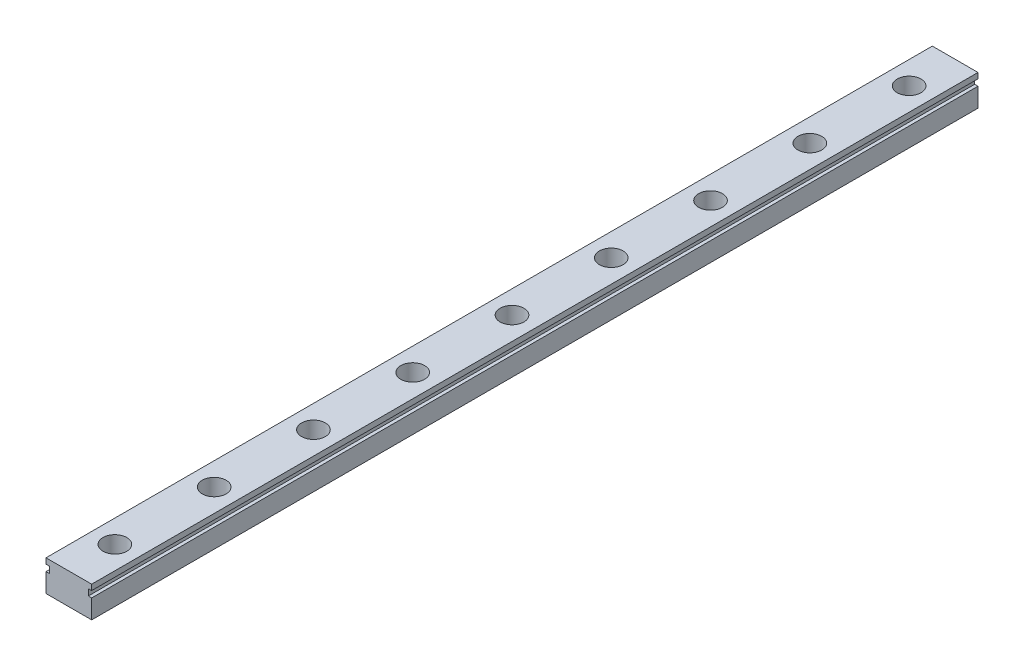
ISO-10303-21;
HEADER;
FILE_DESCRIPTION(('STEP AP214'),'2;1');
FILE_NAME('part.step','',(''),(''),'','','');
FILE_SCHEMA(('AUTOMOTIVE_DESIGN { 1 0 10303 214 1 1 1 1 }'));
ENDSEC;
DATA;
#1=APPLICATION_CONTEXT('core data for automotive mechanical design processes');
#2=APPLICATION_PROTOCOL_DEFINITION('international standard','automotive_design',2000,#1);
#3=PRODUCT_CONTEXT('',#1,'mechanical');
#4=PRODUCT('Part','Part','',(#3));
#5=PRODUCT_RELATED_PRODUCT_CATEGORY('part','',(#4));
#6=PRODUCT_DEFINITION_FORMATION('','',#4);
#7=PRODUCT_DEFINITION_CONTEXT('part definition',#1,'design');
#8=PRODUCT_DEFINITION('design','',#6,#7);
#9=PRODUCT_DEFINITION_SHAPE('','',#8);
#10=(LENGTH_UNIT() NAMED_UNIT(*) SI_UNIT(.MILLI.,.METRE.));
#11=(NAMED_UNIT(*) PLANE_ANGLE_UNIT() SI_UNIT($,.RADIAN.));
#12=(NAMED_UNIT(*) SI_UNIT($,.STERADIAN.) SOLID_ANGLE_UNIT());
#13=UNCERTAINTY_MEASURE_WITH_UNIT(LENGTH_MEASURE(1.E-05),#10,'distance_accuracy_value','');
#14=(GEOMETRIC_REPRESENTATION_CONTEXT(3) GLOBAL_UNCERTAINTY_ASSIGNED_CONTEXT((#13)) GLOBAL_UNIT_ASSIGNED_CONTEXT((#10,
#11,#12)) REPRESENTATION_CONTEXT('',''));
#15=CARTESIAN_POINT('',(0.,0.,0.));
#16=DIRECTION('',(0.,0.,1.));
#17=DIRECTION('',(1.,0.,0.));
#18=AXIS2_PLACEMENT_3D('',#15,#16,#17);
#19=CARTESIAN_POINT('',(5.75,-3.9,223.2));
#20=DIRECTION('',(-1.,0.,0.));
#21=DIRECTION('',(0.,0.,1.));
#22=AXIS2_PLACEMENT_3D('',#19,#20,#21);
#23=PLANE('',#22);
#24=DIRECTION('',(0.,1.,0.));
#25=VECTOR('',#24,1.);
#26=CARTESIAN_POINT('',(5.75,-3.9,0.));
#27=LINE('',#26,#25);
#28=CARTESIAN_POINT('',(5.75,-3.9,0.));
#29=VERTEX_POINT('',#28);
#30=CARTESIAN_POINT('',(5.75,0.900000000000001,0.));
#31=VERTEX_POINT('',#30);
#32=EDGE_CURVE('E152',#29,#31,#27,.T.);
#33=ORIENTED_EDGE('',*,*,#32,.T.);
#34=DIRECTION('',(0.,0.,1.));
#35=VECTOR('',#34,1.);
#36=CARTESIAN_POINT('',(5.75,0.900000000000001,0.));
#37=LINE('',#36,#35);
#38=CARTESIAN_POINT('',(5.75,0.900000000000001,223.2));
#39=VERTEX_POINT('',#38);
#40=EDGE_CURVE('E153',#31,#39,#37,.T.);
#41=ORIENTED_EDGE('',*,*,#40,.T.);
#42=DIRECTION('',(0.,1.,0.));
#43=VECTOR('',#42,1.);
#44=CARTESIAN_POINT('',(5.75,-3.9,223.2));
#45=LINE('',#44,#43);
#46=CARTESIAN_POINT('',(5.75,-3.9,223.2));
#47=VERTEX_POINT('',#46);
#48=EDGE_CURVE('E202',#47,#39,#45,.T.);
#49=ORIENTED_EDGE('',*,*,#48,.F.);
#50=DIRECTION('',(0.,0.,-1.));
#51=VECTOR('',#50,1.);
#52=CARTESIAN_POINT('',(5.75,-3.9,223.2));
#53=LINE('',#52,#51);
#54=EDGE_CURVE('E170',#47,#29,#53,.T.);
#55=ORIENTED_EDGE('',*,*,#54,.T.);
#56=EDGE_LOOP('',(#33,#41,#49,#55));
#57=FACE_BOUND('',#56,.T.);
#58=ADVANCED_FACE('F41',(#57),#23,.F.);
#59=CARTESIAN_POINT('',(-5.75,-3.9,223.2));
#60=DIRECTION('',(1.,0.,0.));
#61=DIRECTION('',(0.,0.,-1.));
#62=AXIS2_PLACEMENT_3D('',#59,#60,#61);
#63=PLANE('',#62);
#64=DIRECTION('',(0.,-1.,0.));
#65=VECTOR('',#64,1.);
#66=CARTESIAN_POINT('',(-5.75,-3.9,0.));
#67=LINE('',#66,#65);
#68=CARTESIAN_POINT('',(-5.75,3.9,0.));
#69=VERTEX_POINT('',#68);
#70=CARTESIAN_POINT('',(-5.75,2.5,0.));
#71=VERTEX_POINT('',#70);
#72=EDGE_CURVE('E165',#69,#71,#67,.T.);
#73=ORIENTED_EDGE('',*,*,#72,.T.);
#74=DIRECTION('',(0.,0.,1.));
#75=VECTOR('',#74,1.);
#76=CARTESIAN_POINT('',(-5.75,2.5,0.));
#77=LINE('',#76,#75);
#78=CARTESIAN_POINT('',(-5.75,2.5,223.2));
#79=VERTEX_POINT('',#78);
#80=EDGE_CURVE('E242',#71,#79,#77,.T.);
#81=ORIENTED_EDGE('',*,*,#80,.T.);
#82=DIRECTION('',(0.,-1.,0.));
#83=VECTOR('',#82,1.);
#84=CARTESIAN_POINT('',(-5.75,-3.9,223.2));
#85=LINE('',#84,#83);
#86=CARTESIAN_POINT('',(-5.75,3.9,223.2));
#87=VERTEX_POINT('',#86);
#88=EDGE_CURVE('E182',#87,#79,#85,.T.);
#89=ORIENTED_EDGE('',*,*,#88,.F.);
#90=DIRECTION('',(0.,0.,-1.));
#91=VECTOR('',#90,1.);
#92=CARTESIAN_POINT('',(-5.75,3.9,223.2));
#93=LINE('',#92,#91);
#94=EDGE_CURVE('E49',#87,#69,#93,.T.);
#95=ORIENTED_EDGE('',*,*,#94,.T.);
#96=EDGE_LOOP('',(#73,#81,#89,#95));
#97=FACE_BOUND('',#96,.T.);
#98=ADVANCED_FACE('F179',(#97),#63,.F.);
#99=CARTESIAN_POINT('',(5.75,2.5,223.2));
#100=VERTEX_POINT('',#99);
#101=CARTESIAN_POINT('',(5.75,3.9,223.2));
#102=VERTEX_POINT('',#101);
#103=EDGE_CURVE('E145',#100,#102,#45,.T.);
#104=ORIENTED_EDGE('',*,*,#103,.F.);
#105=DIRECTION('',(0.,0.,1.));
#106=VECTOR('',#105,1.);
#107=CARTESIAN_POINT('',(5.75,2.5,0.));
#108=LINE('',#107,#106);
#109=CARTESIAN_POINT('',(5.75,2.5,0.));
#110=VERTEX_POINT('',#109);
#111=EDGE_CURVE('E133',#110,#100,#108,.T.);
#112=ORIENTED_EDGE('',*,*,#111,.F.);
#113=CARTESIAN_POINT('',(5.75,3.9,0.));
#114=VERTEX_POINT('',#113);
#115=EDGE_CURVE('E143',#110,#114,#27,.T.);
#116=ORIENTED_EDGE('',*,*,#115,.T.);
#117=DIRECTION('',(0.,0.,-1.));
#118=VECTOR('',#117,1.);
#119=CARTESIAN_POINT('',(5.75,3.9,223.2));
#120=LINE('',#119,#118);
#121=EDGE_CURVE('E11',#102,#114,#120,.T.);
#122=ORIENTED_EDGE('',*,*,#121,.F.);
#123=EDGE_LOOP('',(#104,#112,#116,#122));
#124=FACE_BOUND('',#123,.T.);
#125=ADVANCED_FACE('F43',(#124),#23,.F.);
#126=CARTESIAN_POINT('',(-5.75,3.9,223.2));
#127=DIRECTION('',(0.,-1.,0.));
#128=DIRECTION('',(0.,0.,-1.));
#129=AXIS2_PLACEMENT_3D('',#126,#127,#128);
#130=PLANE('',#129);
#131=CARTESIAN_POINT('',(0.,3.9,211.6));
#132=DIRECTION('',(0.,1.,0.));
#133=DIRECTION('',(0.,0.,1.));
#134=AXIS2_PLACEMENT_3D('',#131,#132,#133);
#135=CIRCLE('',#134,3.);
#136=CARTESIAN_POINT('',(0.,3.9,214.6));
#137=VERTEX_POINT('',#136);
#138=EDGE_CURVE('E300',#137,#137,#135,.T.);
#139=ORIENTED_EDGE('',*,*,#138,.F.);
#140=EDGE_LOOP('',(#139));
#141=FACE_BOUND('',#140,.T.);
#142=CARTESIAN_POINT('',(0.,3.9,186.6));
#143=DIRECTION('',(0.,1.,0.));
#144=DIRECTION('',(0.,0.,1.));
#145=AXIS2_PLACEMENT_3D('',#142,#143,#144);
#146=CIRCLE('',#145,3.);
#147=CARTESIAN_POINT('',(0.,3.9,189.6));
#148=VERTEX_POINT('',#147);
#149=EDGE_CURVE('E297',#148,#148,#146,.T.);
#150=ORIENTED_EDGE('',*,*,#149,.F.);
#151=EDGE_LOOP('',(#150));
#152=FACE_BOUND('',#151,.T.);
#153=CARTESIAN_POINT('',(0.,3.9,161.6));
#154=DIRECTION('',(0.,1.,0.));
#155=DIRECTION('',(0.,0.,1.));
#156=AXIS2_PLACEMENT_3D('',#153,#154,#155);
#157=CIRCLE('',#156,3.);
#158=CARTESIAN_POINT('',(0.,3.9,164.6));
#159=VERTEX_POINT('',#158);
#160=EDGE_CURVE('E291',#159,#159,#157,.T.);
#161=ORIENTED_EDGE('',*,*,#160,.F.);
#162=EDGE_LOOP('',(#161));
#163=FACE_BOUND('',#162,.T.);
#164=CARTESIAN_POINT('',(0.,3.9,136.6));
#165=DIRECTION('',(0.,1.,0.));
#166=DIRECTION('',(0.,0.,1.));
#167=AXIS2_PLACEMENT_3D('',#164,#165,#166);
#168=CIRCLE('',#167,3.);
#169=CARTESIAN_POINT('',(0.,3.9,139.6));
#170=VERTEX_POINT('',#169);
#171=EDGE_CURVE('E285',#170,#170,#168,.T.);
#172=ORIENTED_EDGE('',*,*,#171,.F.);
#173=EDGE_LOOP('',(#172));
#174=FACE_BOUND('',#173,.T.);
#175=CARTESIAN_POINT('',(0.,3.9,111.6));
#176=DIRECTION('',(0.,1.,0.));
#177=DIRECTION('',(0.,0.,1.));
#178=AXIS2_PLACEMENT_3D('',#175,#176,#177);
#179=CIRCLE('',#178,3.);
#180=CARTESIAN_POINT('',(0.,3.9,114.6));
#181=VERTEX_POINT('',#180);
#182=EDGE_CURVE('E279',#181,#181,#179,.T.);
#183=ORIENTED_EDGE('',*,*,#182,.F.);
#184=EDGE_LOOP('',(#183));
#185=FACE_BOUND('',#184,.T.);
#186=CARTESIAN_POINT('',(0.,3.9,86.6));
#187=DIRECTION('',(0.,1.,0.));
#188=DIRECTION('',(0.,0.,1.));
#189=AXIS2_PLACEMENT_3D('',#186,#187,#188);
#190=CIRCLE('',#189,3.);
#191=CARTESIAN_POINT('',(0.,3.9,89.6));
#192=VERTEX_POINT('',#191);
#193=EDGE_CURVE('E273',#192,#192,#190,.T.);
#194=ORIENTED_EDGE('',*,*,#193,.F.);
#195=EDGE_LOOP('',(#194));
#196=FACE_BOUND('',#195,.T.);
#197=CARTESIAN_POINT('',(0.,3.9,61.6));
#198=DIRECTION('',(0.,1.,0.));
#199=DIRECTION('',(0.,0.,1.));
#200=AXIS2_PLACEMENT_3D('',#197,#198,#199);
#201=CIRCLE('',#200,3.);
#202=CARTESIAN_POINT('',(0.,3.9,64.6));
#203=VERTEX_POINT('',#202);
#204=EDGE_CURVE('E267',#203,#203,#201,.T.);
#205=ORIENTED_EDGE('',*,*,#204,.F.);
#206=EDGE_LOOP('',(#205));
#207=FACE_BOUND('',#206,.T.);
#208=CARTESIAN_POINT('',(0.,3.9,36.6));
#209=DIRECTION('',(0.,1.,0.));
#210=DIRECTION('',(0.,0.,1.));
#211=AXIS2_PLACEMENT_3D('',#208,#209,#210);
#212=CIRCLE('',#211,3.);
#213=CARTESIAN_POINT('',(0.,3.9,39.6));
#214=VERTEX_POINT('',#213);
#215=EDGE_CURVE('E261',#214,#214,#212,.T.);
#216=ORIENTED_EDGE('',*,*,#215,.F.);
#217=EDGE_LOOP('',(#216));
#218=FACE_BOUND('',#217,.T.);
#219=CARTESIAN_POINT('',(0.,3.9,11.6));
#220=DIRECTION('',(0.,1.,0.));
#221=DIRECTION('',(0.,0.,1.));
#222=AXIS2_PLACEMENT_3D('',#219,#220,#221);
#223=CIRCLE('',#222,3.);
#224=CARTESIAN_POINT('',(0.,3.9,14.6));
#225=VERTEX_POINT('',#224);
#226=EDGE_CURVE('E254',#225,#225,#223,.T.);
#227=ORIENTED_EDGE('',*,*,#226,.F.);
#228=EDGE_LOOP('',(#227));
#229=FACE_BOUND('',#228,.T.);
#230=DIRECTION('',(-1.,0.,0.));
#231=VECTOR('',#230,1.);
#232=CARTESIAN_POINT('',(-5.75,3.9,0.));
#233=LINE('',#232,#231);
#234=EDGE_CURVE('E151',#114,#69,#233,.T.);
#235=ORIENTED_EDGE('',*,*,#234,.T.);
#236=ORIENTED_EDGE('',*,*,#94,.F.);
#237=DIRECTION('',(-1.,0.,0.));
#238=VECTOR('',#237,1.);
#239=CARTESIAN_POINT('',(-5.75,3.9,223.2));
#240=LINE('',#239,#238);
#241=EDGE_CURVE('E205',#102,#87,#240,.T.);
#242=ORIENTED_EDGE('',*,*,#241,.F.);
#243=ORIENTED_EDGE('',*,*,#121,.T.);
#244=EDGE_LOOP('',(#235,#236,#242,#243));
#245=FACE_BOUND('',#244,.T.);
#246=ADVANCED_FACE('F382',(#141,#152,#163,#174,#185,#196,#207,#218,#229,#245),#130,.F.);
#247=CARTESIAN_POINT('',(-5.75,0.900000000000001,223.2));
#248=VERTEX_POINT('',#247);
#249=CARTESIAN_POINT('',(-5.75,-3.9,223.2));
#250=VERTEX_POINT('',#249);
#251=EDGE_CURVE('E206',#248,#250,#85,.T.);
#252=ORIENTED_EDGE('',*,*,#251,.F.);
#253=DIRECTION('',(0.,0.,1.));
#254=VECTOR('',#253,1.);
#255=CARTESIAN_POINT('',(-5.75,0.900000000000001,0.));
#256=LINE('',#255,#254);
#257=CARTESIAN_POINT('',(-5.75,0.900000000000001,0.));
#258=VERTEX_POINT('',#257);
#259=EDGE_CURVE('E190',#258,#248,#256,.T.);
#260=ORIENTED_EDGE('',*,*,#259,.F.);
#261=CARTESIAN_POINT('',(-5.75,-3.9,0.));
#262=VERTEX_POINT('',#261);
#263=EDGE_CURVE('E164',#258,#262,#67,.T.);
#264=ORIENTED_EDGE('',*,*,#263,.T.);
#265=DIRECTION('',(0.,0.,-1.));
#266=VECTOR('',#265,1.);
#267=CARTESIAN_POINT('',(-5.75,-3.9,223.2));
#268=LINE('',#267,#266);
#269=EDGE_CURVE('E173',#250,#262,#268,.T.);
#270=ORIENTED_EDGE('',*,*,#269,.F.);
#271=EDGE_LOOP('',(#252,#260,#264,#270));
#272=FACE_BOUND('',#271,.T.);
#273=ADVANCED_FACE('F219',(#272),#63,.F.);
#274=CARTESIAN_POINT('',(-5.75,-3.9,223.2));
#275=DIRECTION('',(0.,1.,0.));
#276=DIRECTION('',(0.,0.,1.));
#277=AXIS2_PLACEMENT_3D('',#274,#275,#276);
#278=PLANE('',#277);
#279=CARTESIAN_POINT('',(0.,-3.9,211.6));
#280=DIRECTION('',(0.,1.,0.));
#281=DIRECTION('',(0.,0.,1.));
#282=AXIS2_PLACEMENT_3D('',#279,#280,#281);
#283=CIRCLE('',#282,1.7);
#284=CARTESIAN_POINT('',(0.,-3.9,213.3));
#285=VERTEX_POINT('',#284);
#286=EDGE_CURVE('E255',#285,#285,#283,.T.);
#287=ORIENTED_EDGE('',*,*,#286,.T.);
#288=EDGE_LOOP('',(#287));
#289=FACE_BOUND('',#288,.T.);
#290=CARTESIAN_POINT('',(0.,-3.9,186.6));
#291=DIRECTION('',(0.,1.,0.));
#292=DIRECTION('',(0.,0.,1.));
#293=AXIS2_PLACEMENT_3D('',#290,#291,#292);
#294=CIRCLE('',#293,1.7);
#295=CARTESIAN_POINT('',(0.,-3.9,188.3));
#296=VERTEX_POINT('',#295);
#297=EDGE_CURVE('E347',#296,#296,#294,.T.);
#298=ORIENTED_EDGE('',*,*,#297,.T.);
#299=EDGE_LOOP('',(#298));
#300=FACE_BOUND('',#299,.T.);
#301=CARTESIAN_POINT('',(0.,-3.9,161.6));
#302=DIRECTION('',(0.,1.,0.));
#303=DIRECTION('',(0.,0.,1.));
#304=AXIS2_PLACEMENT_3D('',#301,#302,#303);
#305=CIRCLE('',#304,1.69999999999999);
#306=CARTESIAN_POINT('',(0.,-3.9,163.3));
#307=VERTEX_POINT('',#306);
#308=EDGE_CURVE('E341',#307,#307,#305,.T.);
#309=ORIENTED_EDGE('',*,*,#308,.T.);
#310=EDGE_LOOP('',(#309));
#311=FACE_BOUND('',#310,.T.);
#312=CARTESIAN_POINT('',(0.,-3.9,136.6));
#313=DIRECTION('',(0.,1.,0.));
#314=DIRECTION('',(0.,0.,1.));
#315=AXIS2_PLACEMENT_3D('',#312,#313,#314);
#316=CIRCLE('',#315,1.7);
#317=CARTESIAN_POINT('',(0.,-3.9,138.3));
#318=VERTEX_POINT('',#317);
#319=EDGE_CURVE('E335',#318,#318,#316,.T.);
#320=ORIENTED_EDGE('',*,*,#319,.T.);
#321=EDGE_LOOP('',(#320));
#322=FACE_BOUND('',#321,.T.);
#323=CARTESIAN_POINT('',(0.,-3.9,111.6));
#324=DIRECTION('',(0.,1.,0.));
#325=DIRECTION('',(0.,0.,1.));
#326=AXIS2_PLACEMENT_3D('',#323,#324,#325);
#327=CIRCLE('',#326,1.7);
#328=CARTESIAN_POINT('',(0.,-3.9,113.3));
#329=VERTEX_POINT('',#328);
#330=EDGE_CURVE('E329',#329,#329,#327,.T.);
#331=ORIENTED_EDGE('',*,*,#330,.T.);
#332=EDGE_LOOP('',(#331));
#333=FACE_BOUND('',#332,.T.);
#334=CARTESIAN_POINT('',(0.,-3.9,86.6));
#335=DIRECTION('',(0.,1.,0.));
#336=DIRECTION('',(0.,0.,1.));
#337=AXIS2_PLACEMENT_3D('',#334,#335,#336);
#338=CIRCLE('',#337,1.7);
#339=CARTESIAN_POINT('',(0.,-3.9,88.3));
#340=VERTEX_POINT('',#339);
#341=EDGE_CURVE('E323',#340,#340,#338,.T.);
#342=ORIENTED_EDGE('',*,*,#341,.T.);
#343=EDGE_LOOP('',(#342));
#344=FACE_BOUND('',#343,.T.);
#345=CARTESIAN_POINT('',(0.,-3.9,61.6));
#346=DIRECTION('',(0.,1.,0.));
#347=DIRECTION('',(0.,0.,1.));
#348=AXIS2_PLACEMENT_3D('',#345,#346,#347);
#349=CIRCLE('',#348,1.7);
#350=CARTESIAN_POINT('',(0.,-3.9,63.3));
#351=VERTEX_POINT('',#350);
#352=EDGE_CURVE('E317',#351,#351,#349,.T.);
#353=ORIENTED_EDGE('',*,*,#352,.T.);
#354=EDGE_LOOP('',(#353));
#355=FACE_BOUND('',#354,.T.);
#356=CARTESIAN_POINT('',(0.,-3.9,36.6));
#357=DIRECTION('',(0.,1.,0.));
#358=DIRECTION('',(0.,0.,1.));
#359=AXIS2_PLACEMENT_3D('',#356,#357,#358);
#360=CIRCLE('',#359,1.7);
#361=CARTESIAN_POINT('',(0.,-3.9,38.3));
#362=VERTEX_POINT('',#361);
#363=EDGE_CURVE('E311',#362,#362,#360,.T.);
#364=ORIENTED_EDGE('',*,*,#363,.T.);
#365=EDGE_LOOP('',(#364));
#366=FACE_BOUND('',#365,.T.);
#367=CARTESIAN_POINT('',(0.,-3.9,11.6));
#368=DIRECTION('',(0.,1.,0.));
#369=DIRECTION('',(0.,0.,1.));
#370=AXIS2_PLACEMENT_3D('',#367,#368,#369);
#371=CIRCLE('',#370,1.7);
#372=CARTESIAN_POINT('',(0.,-3.9,13.3));
#373=VERTEX_POINT('',#372);
#374=EDGE_CURVE('E305',#373,#373,#371,.T.);
#375=ORIENTED_EDGE('',*,*,#374,.T.);
#376=EDGE_LOOP('',(#375));
#377=FACE_BOUND('',#376,.T.);
#378=DIRECTION('',(1.,0.,0.));
#379=VECTOR('',#378,1.);
#380=CARTESIAN_POINT('',(-5.75,-3.9,0.));
#381=LINE('',#380,#379);
#382=EDGE_CURVE('E168',#262,#29,#381,.T.);
#383=ORIENTED_EDGE('',*,*,#382,.T.);
#384=ORIENTED_EDGE('',*,*,#54,.F.);
#385=DIRECTION('',(1.,0.,0.));
#386=VECTOR('',#385,1.);
#387=CARTESIAN_POINT('',(-5.75,-3.9,223.2));
#388=LINE('',#387,#386);
#389=EDGE_CURVE('E161',#250,#47,#388,.T.);
#390=ORIENTED_EDGE('',*,*,#389,.F.);
#391=ORIENTED_EDGE('',*,*,#269,.T.);
#392=EDGE_LOOP('',(#383,#384,#390,#391));
#393=FACE_BOUND('',#392,.T.);
#394=ADVANCED_FACE('F223',(#289,#300,#311,#322,#333,#344,#355,#366,#377,#393),#278,.F.);
#395=CARTESIAN_POINT('',(0.,0.,223.2));
#396=DIRECTION('',(0.,0.,-1.));
#397=DIRECTION('',(-1.,0.,0.));
#398=AXIS2_PLACEMENT_3D('',#395,#396,#397);
#399=PLANE('',#398);
#400=ORIENTED_EDGE('',*,*,#48,.T.);
#401=DIRECTION('',(1.,0.,0.));
#402=VECTOR('',#401,1.);
#403=CARTESIAN_POINT('',(5.75,0.900000000000001,223.2));
#404=LINE('',#403,#402);
#405=CARTESIAN_POINT('',(4.91474977144023,0.900000000000001,223.2));
#406=VERTEX_POINT('',#405);
#407=EDGE_CURVE('E138',#406,#39,#404,.T.);
#408=ORIENTED_EDGE('',*,*,#407,.F.);
#409=DIRECTION('',(0.,-1.,0.));
#410=VECTOR('',#409,1.);
#411=CARTESIAN_POINT('',(4.91474977144023,2.5,223.2));
#412=LINE('',#411,#410);
#413=CARTESIAN_POINT('',(4.91474977144023,2.5,223.2));
#414=VERTEX_POINT('',#413);
#415=EDGE_CURVE('E230',#414,#406,#412,.T.);
#416=ORIENTED_EDGE('',*,*,#415,.F.);
#417=DIRECTION('',(-1.,0.,0.));
#418=VECTOR('',#417,1.);
#419=CARTESIAN_POINT('',(5.75,2.5,223.2));
#420=LINE('',#419,#418);
#421=EDGE_CURVE('E233',#100,#414,#420,.T.);
#422=ORIENTED_EDGE('',*,*,#421,.F.);
#423=ORIENTED_EDGE('',*,*,#103,.T.);
#424=ORIENTED_EDGE('',*,*,#241,.T.);
#425=ORIENTED_EDGE('',*,*,#88,.T.);
#426=DIRECTION('',(-1.,0.,0.));
#427=VECTOR('',#426,1.);
#428=CARTESIAN_POINT('',(-5.75,2.5,223.2));
#429=LINE('',#428,#427);
#430=CARTESIAN_POINT('',(-4.91474977144023,2.5,223.2));
#431=VERTEX_POINT('',#430);
#432=EDGE_CURVE('E201',#431,#79,#429,.T.);
#433=ORIENTED_EDGE('',*,*,#432,.F.);
#434=DIRECTION('',(0.,1.,0.));
#435=VECTOR('',#434,1.);
#436=CARTESIAN_POINT('',(-4.91474977144023,2.5,223.2));
#437=LINE('',#436,#435);
#438=CARTESIAN_POINT('',(-4.91474977144023,0.900000000000001,223.2));
#439=VERTEX_POINT('',#438);
#440=EDGE_CURVE('E245',#439,#431,#437,.T.);
#441=ORIENTED_EDGE('',*,*,#440,.F.);
#442=DIRECTION('',(1.,0.,0.));
#443=VECTOR('',#442,1.);
#444=CARTESIAN_POINT('',(-5.75,0.900000000000001,223.2));
#445=LINE('',#444,#443);
#446=EDGE_CURVE('E197',#248,#439,#445,.T.);
#447=ORIENTED_EDGE('',*,*,#446,.F.);
#448=ORIENTED_EDGE('',*,*,#251,.T.);
#449=ORIENTED_EDGE('',*,*,#389,.T.);
#450=EDGE_LOOP('',(#400,#408,#416,#422,#423,#424,#425,#433,#441,#447,#448,#449));
#451=FACE_BOUND('',#450,.T.);
#452=ADVANCED_FACE('F212',(#451),#399,.F.);
#453=CARTESIAN_POINT('',(0.,0.,0.));
#454=DIRECTION('',(0.,0.,-1.));
#455=DIRECTION('',(-1.,0.,0.));
#456=AXIS2_PLACEMENT_3D('',#453,#454,#455);
#457=PLANE('',#456);
#458=DIRECTION('',(1.,0.,0.));
#459=VECTOR('',#458,1.);
#460=CARTESIAN_POINT('',(5.75,0.900000000000001,0.));
#461=LINE('',#460,#459);
#462=CARTESIAN_POINT('',(4.91474977144023,0.900000000000001,0.));
#463=VERTEX_POINT('',#462);
#464=EDGE_CURVE('E146',#463,#31,#461,.T.);
#465=ORIENTED_EDGE('',*,*,#464,.T.);
#466=ORIENTED_EDGE('',*,*,#32,.F.);
#467=ORIENTED_EDGE('',*,*,#382,.F.);
#468=ORIENTED_EDGE('',*,*,#263,.F.);
#469=DIRECTION('',(1.,0.,0.));
#470=VECTOR('',#469,1.);
#471=CARTESIAN_POINT('',(-5.75,0.900000000000001,0.));
#472=LINE('',#471,#470);
#473=CARTESIAN_POINT('',(-4.91474977144023,0.900000000000001,0.));
#474=VERTEX_POINT('',#473);
#475=EDGE_CURVE('E192',#258,#474,#472,.T.);
#476=ORIENTED_EDGE('',*,*,#475,.T.);
#477=DIRECTION('',(0.,1.,0.));
#478=VECTOR('',#477,1.);
#479=CARTESIAN_POINT('',(-4.91474977144023,2.5,0.));
#480=LINE('',#479,#478);
#481=CARTESIAN_POINT('',(-4.91474977144023,2.5,0.));
#482=VERTEX_POINT('',#481);
#483=EDGE_CURVE('E64',#474,#482,#480,.T.);
#484=ORIENTED_EDGE('',*,*,#483,.T.);
#485=DIRECTION('',(-1.,0.,0.));
#486=VECTOR('',#485,1.);
#487=CARTESIAN_POINT('',(-5.75,2.5,0.));
#488=LINE('',#487,#486);
#489=EDGE_CURVE('E187',#482,#71,#488,.T.);
#490=ORIENTED_EDGE('',*,*,#489,.T.);
#491=ORIENTED_EDGE('',*,*,#72,.F.);
#492=ORIENTED_EDGE('',*,*,#234,.F.);
#493=ORIENTED_EDGE('',*,*,#115,.F.);
#494=DIRECTION('',(-1.,0.,0.));
#495=VECTOR('',#494,1.);
#496=CARTESIAN_POINT('',(5.75,2.5,0.));
#497=LINE('',#496,#495);
#498=CARTESIAN_POINT('',(4.91474977144023,2.5,0.));
#499=VERTEX_POINT('',#498);
#500=EDGE_CURVE('E129',#110,#499,#497,.T.);
#501=ORIENTED_EDGE('',*,*,#500,.T.);
#502=DIRECTION('',(0.,-1.,0.));
#503=VECTOR('',#502,1.);
#504=CARTESIAN_POINT('',(4.91474977144023,2.5,0.));
#505=LINE('',#504,#503);
#506=EDGE_CURVE('E56',#499,#463,#505,.T.);
#507=ORIENTED_EDGE('',*,*,#506,.T.);
#508=EDGE_LOOP('',(#465,#466,#467,#468,#476,#484,#490,#491,#492,#493,#501,#507));
#509=FACE_BOUND('',#508,.T.);
#510=ADVANCED_FACE('F149',(#509),#457,.T.);
#511=CARTESIAN_POINT('',(-5.75,2.5,0.));
#512=DIRECTION('',(0.,1.,0.));
#513=DIRECTION('',(0.,0.,1.));
#514=AXIS2_PLACEMENT_3D('',#511,#512,#513);
#515=PLANE('',#514);
#516=ORIENTED_EDGE('',*,*,#432,.T.);
#517=ORIENTED_EDGE('',*,*,#80,.F.);
#518=ORIENTED_EDGE('',*,*,#489,.F.);
#519=DIRECTION('',(0.,0.,1.));
#520=VECTOR('',#519,1.);
#521=CARTESIAN_POINT('',(-4.91474977144023,2.5,0.));
#522=LINE('',#521,#520);
#523=EDGE_CURVE('E240',#482,#431,#522,.T.);
#524=ORIENTED_EDGE('',*,*,#523,.T.);
#525=EDGE_LOOP('',(#516,#517,#518,#524));
#526=FACE_BOUND('',#525,.T.);
#527=ADVANCED_FACE('F457',(#526),#515,.F.);
#528=CARTESIAN_POINT('',(-4.91474977144023,2.5,0.));
#529=DIRECTION('',(1.,0.,0.));
#530=DIRECTION('',(0.,0.,-1.));
#531=AXIS2_PLACEMENT_3D('',#528,#529,#530);
#532=PLANE('',#531);
#533=ORIENTED_EDGE('',*,*,#440,.T.);
#534=ORIENTED_EDGE('',*,*,#523,.F.);
#535=ORIENTED_EDGE('',*,*,#483,.F.);
#536=DIRECTION('',(0.,0.,1.));
#537=VECTOR('',#536,1.);
#538=CARTESIAN_POINT('',(-4.91474977144023,0.900000000000001,0.));
#539=LINE('',#538,#537);
#540=EDGE_CURVE('E194',#474,#439,#539,.T.);
#541=ORIENTED_EDGE('',*,*,#540,.T.);
#542=EDGE_LOOP('',(#533,#534,#535,#541));
#543=FACE_BOUND('',#542,.T.);
#544=ADVANCED_FACE('F464',(#543),#532,.F.);
#545=CARTESIAN_POINT('',(-5.75,0.900000000000001,0.));
#546=DIRECTION('',(0.,-1.,0.));
#547=DIRECTION('',(0.,0.,-1.));
#548=AXIS2_PLACEMENT_3D('',#545,#546,#547);
#549=PLANE('',#548);
#550=ORIENTED_EDGE('',*,*,#446,.T.);
#551=ORIENTED_EDGE('',*,*,#540,.F.);
#552=ORIENTED_EDGE('',*,*,#475,.F.);
#553=ORIENTED_EDGE('',*,*,#259,.T.);
#554=EDGE_LOOP('',(#550,#551,#552,#553));
#555=FACE_BOUND('',#554,.T.);
#556=ADVANCED_FACE('F471',(#555),#549,.F.);
#557=CARTESIAN_POINT('',(5.75,0.900000000000001,0.));
#558=DIRECTION('',(0.,-1.,0.));
#559=DIRECTION('',(0.,0.,-1.));
#560=AXIS2_PLACEMENT_3D('',#557,#558,#559);
#561=PLANE('',#560);
#562=ORIENTED_EDGE('',*,*,#407,.T.);
#563=ORIENTED_EDGE('',*,*,#40,.F.);
#564=ORIENTED_EDGE('',*,*,#464,.F.);
#565=DIRECTION('',(0.,0.,1.));
#566=VECTOR('',#565,1.);
#567=CARTESIAN_POINT('',(4.91474977144023,0.900000000000001,0.));
#568=LINE('',#567,#566);
#569=EDGE_CURVE('E157',#463,#406,#568,.T.);
#570=ORIENTED_EDGE('',*,*,#569,.T.);
#571=EDGE_LOOP('',(#562,#563,#564,#570));
#572=FACE_BOUND('',#571,.T.);
#573=ADVANCED_FACE('F478',(#572),#561,.F.);
#574=CARTESIAN_POINT('',(4.91474977144023,2.5,0.));
#575=DIRECTION('',(-1.,0.,0.));
#576=DIRECTION('',(0.,0.,1.));
#577=AXIS2_PLACEMENT_3D('',#574,#575,#576);
#578=PLANE('',#577);
#579=ORIENTED_EDGE('',*,*,#415,.T.);
#580=ORIENTED_EDGE('',*,*,#569,.F.);
#581=ORIENTED_EDGE('',*,*,#506,.F.);
#582=DIRECTION('',(0.,0.,1.));
#583=VECTOR('',#582,1.);
#584=CARTESIAN_POINT('',(4.91474977144023,2.5,0.));
#585=LINE('',#584,#583);
#586=EDGE_CURVE('E135',#499,#414,#585,.T.);
#587=ORIENTED_EDGE('',*,*,#586,.T.);
#588=EDGE_LOOP('',(#579,#580,#581,#587));
#589=FACE_BOUND('',#588,.T.);
#590=ADVANCED_FACE('F413',(#589),#578,.F.);
#591=CARTESIAN_POINT('',(5.75,2.5,0.));
#592=DIRECTION('',(0.,1.,0.));
#593=DIRECTION('',(0.,0.,1.));
#594=AXIS2_PLACEMENT_3D('',#591,#592,#593);
#595=PLANE('',#594);
#596=ORIENTED_EDGE('',*,*,#421,.T.);
#597=ORIENTED_EDGE('',*,*,#586,.F.);
#598=ORIENTED_EDGE('',*,*,#500,.F.);
#599=ORIENTED_EDGE('',*,*,#111,.T.);
#600=EDGE_LOOP('',(#596,#597,#598,#599));
#601=FACE_BOUND('',#600,.T.);
#602=ADVANCED_FACE('F132',(#601),#595,.F.);
#603=CARTESIAN_POINT('',(0.,-0.799999999999999,11.6));
#604=DIRECTION('',(0.,1.,0.));
#605=DIRECTION('',(0.,0.,1.));
#606=AXIS2_PLACEMENT_3D('',#603,#604,#605);
#607=CYLINDRICAL_SURFACE('',#606,3.);
#608=CARTESIAN_POINT('',(0.,-0.799999999999999,11.6));
#609=DIRECTION('',(0.,1.,0.));
#610=DIRECTION('',(0.,0.,1.));
#611=AXIS2_PLACEMENT_3D('',#608,#609,#610);
#612=CIRCLE('',#611,3.);
#613=CARTESIAN_POINT('',(0.,-0.799999999999999,14.6));
#614=VERTEX_POINT('',#613);
#615=EDGE_CURVE('E251',#614,#614,#612,.T.);
#616=ORIENTED_EDGE('',*,*,#615,.F.);
#617=EDGE_LOOP('',(#616));
#618=FACE_BOUND('',#617,.T.);
#619=ORIENTED_EDGE('',*,*,#226,.T.);
#620=EDGE_LOOP('',(#619));
#621=FACE_BOUND('',#620,.T.);
#622=ADVANCED_FACE('F401',(#618,#621),#607,.F.);
#623=CARTESIAN_POINT('',(0.,-0.799999999999999,11.6));
#624=DIRECTION('',(0.,1.,0.));
#625=DIRECTION('',(0.,0.,1.));
#626=AXIS2_PLACEMENT_3D('',#623,#624,#625);
#627=PLANE('',#626);
#628=CARTESIAN_POINT('',(0.,-0.799999999999999,11.6));
#629=DIRECTION('',(0.,1.,0.));
#630=DIRECTION('',(0.,0.,1.));
#631=AXIS2_PLACEMENT_3D('',#628,#629,#630);
#632=CIRCLE('',#631,1.7);
#633=CARTESIAN_POINT('',(0.,-0.799999999999999,13.3));
#634=VERTEX_POINT('',#633);
#635=EDGE_CURVE('E308',#634,#634,#632,.T.);
#636=ORIENTED_EDGE('',*,*,#635,.F.);
#637=EDGE_LOOP('',(#636));
#638=FACE_BOUND('',#637,.T.);
#639=ORIENTED_EDGE('',*,*,#615,.T.);
#640=EDGE_LOOP('',(#639));
#641=FACE_BOUND('',#640,.T.);
#642=ADVANCED_FACE('F403',(#638,#641),#627,.T.);
#643=CARTESIAN_POINT('',(0.,-0.799999999999999,36.6));
#644=DIRECTION('',(0.,1.,0.));
#645=DIRECTION('',(0.,0.,1.));
#646=AXIS2_PLACEMENT_3D('',#643,#644,#645);
#647=CYLINDRICAL_SURFACE('',#646,3.);
#648=CARTESIAN_POINT('',(0.,-0.799999999999999,36.6));
#649=DIRECTION('',(0.,1.,0.));
#650=DIRECTION('',(0.,0.,1.));
#651=AXIS2_PLACEMENT_3D('',#648,#649,#650);
#652=CIRCLE('',#651,3.);
#653=CARTESIAN_POINT('',(0.,-0.799999999999999,39.6));
#654=VERTEX_POINT('',#653);
#655=EDGE_CURVE('E258',#654,#654,#652,.T.);
#656=ORIENTED_EDGE('',*,*,#655,.F.);
#657=EDGE_LOOP('',(#656));
#658=FACE_BOUND('',#657,.T.);
#659=ORIENTED_EDGE('',*,*,#215,.T.);
#660=EDGE_LOOP('',(#659));
#661=FACE_BOUND('',#660,.T.);
#662=ADVANCED_FACE('F410',(#658,#661),#647,.F.);
#663=CARTESIAN_POINT('',(0.,-0.799999999999999,36.6));
#664=DIRECTION('',(0.,1.,0.));
#665=DIRECTION('',(0.,0.,1.));
#666=AXIS2_PLACEMENT_3D('',#663,#664,#665);
#667=PLANE('',#666);
#668=CARTESIAN_POINT('',(0.,-0.799999999999999,36.6));
#669=DIRECTION('',(0.,1.,0.));
#670=DIRECTION('',(0.,0.,1.));
#671=AXIS2_PLACEMENT_3D('',#668,#669,#670);
#672=CIRCLE('',#671,1.7);
#673=CARTESIAN_POINT('',(0.,-0.799999999999999,38.3));
#674=VERTEX_POINT('',#673);
#675=EDGE_CURVE('E314',#674,#674,#672,.T.);
#676=ORIENTED_EDGE('',*,*,#675,.F.);
#677=EDGE_LOOP('',(#676));
#678=FACE_BOUND('',#677,.T.);
#679=ORIENTED_EDGE('',*,*,#655,.T.);
#680=EDGE_LOOP('',(#679));
#681=FACE_BOUND('',#680,.T.);
#682=ADVANCED_FACE('F523',(#678,#681),#667,.T.);
#683=CARTESIAN_POINT('',(0.,-0.799999999999999,61.6));
#684=DIRECTION('',(0.,1.,0.));
#685=DIRECTION('',(0.,0.,1.));
#686=AXIS2_PLACEMENT_3D('',#683,#684,#685);
#687=CYLINDRICAL_SURFACE('',#686,3.);
#688=CARTESIAN_POINT('',(0.,-0.799999999999999,61.6));
#689=DIRECTION('',(0.,1.,0.));
#690=DIRECTION('',(0.,0.,1.));
#691=AXIS2_PLACEMENT_3D('',#688,#689,#690);
#692=CIRCLE('',#691,3.);
#693=CARTESIAN_POINT('',(0.,-0.799999999999999,64.6));
#694=VERTEX_POINT('',#693);
#695=EDGE_CURVE('E264',#694,#694,#692,.T.);
#696=ORIENTED_EDGE('',*,*,#695,.F.);
#697=EDGE_LOOP('',(#696));
#698=FACE_BOUND('',#697,.T.);
#699=ORIENTED_EDGE('',*,*,#204,.T.);
#700=EDGE_LOOP('',(#699));
#701=FACE_BOUND('',#700,.T.);
#702=ADVANCED_FACE('F534',(#698,#701),#687,.F.);
#703=CARTESIAN_POINT('',(0.,-0.799999999999999,61.6));
#704=DIRECTION('',(0.,1.,0.));
#705=DIRECTION('',(0.,0.,1.));
#706=AXIS2_PLACEMENT_3D('',#703,#704,#705);
#707=PLANE('',#706);
#708=CARTESIAN_POINT('',(0.,-0.799999999999999,61.6));
#709=DIRECTION('',(0.,1.,0.));
#710=DIRECTION('',(0.,0.,1.));
#711=AXIS2_PLACEMENT_3D('',#708,#709,#710);
#712=CIRCLE('',#711,1.7);
#713=CARTESIAN_POINT('',(0.,-0.799999999999999,63.3));
#714=VERTEX_POINT('',#713);
#715=EDGE_CURVE('E320',#714,#714,#712,.T.);
#716=ORIENTED_EDGE('',*,*,#715,.F.);
#717=EDGE_LOOP('',(#716));
#718=FACE_BOUND('',#717,.T.);
#719=ORIENTED_EDGE('',*,*,#695,.T.);
#720=EDGE_LOOP('',(#719));
#721=FACE_BOUND('',#720,.T.);
#722=ADVANCED_FACE('F544',(#718,#721),#707,.T.);
#723=CARTESIAN_POINT('',(0.,-0.799999999999999,86.6));
#724=DIRECTION('',(0.,1.,0.));
#725=DIRECTION('',(0.,0.,1.));
#726=AXIS2_PLACEMENT_3D('',#723,#724,#725);
#727=CYLINDRICAL_SURFACE('',#726,3.);
#728=CARTESIAN_POINT('',(0.,-0.799999999999999,86.6));
#729=DIRECTION('',(0.,1.,0.));
#730=DIRECTION('',(0.,0.,1.));
#731=AXIS2_PLACEMENT_3D('',#728,#729,#730);
#732=CIRCLE('',#731,3.);
#733=CARTESIAN_POINT('',(0.,-0.799999999999999,89.6));
#734=VERTEX_POINT('',#733);
#735=EDGE_CURVE('E270',#734,#734,#732,.T.);
#736=ORIENTED_EDGE('',*,*,#735,.F.);
#737=EDGE_LOOP('',(#736));
#738=FACE_BOUND('',#737,.T.);
#739=ORIENTED_EDGE('',*,*,#193,.T.);
#740=EDGE_LOOP('',(#739));
#741=FACE_BOUND('',#740,.T.);
#742=ADVANCED_FACE('F555',(#738,#741),#727,.F.);
#743=CARTESIAN_POINT('',(0.,-0.799999999999999,86.6));
#744=DIRECTION('',(0.,1.,0.));
#745=DIRECTION('',(0.,0.,1.));
#746=AXIS2_PLACEMENT_3D('',#743,#744,#745);
#747=PLANE('',#746);
#748=CARTESIAN_POINT('',(0.,-0.799999999999999,86.6));
#749=DIRECTION('',(0.,1.,0.));
#750=DIRECTION('',(0.,0.,1.));
#751=AXIS2_PLACEMENT_3D('',#748,#749,#750);
#752=CIRCLE('',#751,1.7);
#753=CARTESIAN_POINT('',(0.,-0.799999999999999,88.3));
#754=VERTEX_POINT('',#753);
#755=EDGE_CURVE('E326',#754,#754,#752,.T.);
#756=ORIENTED_EDGE('',*,*,#755,.F.);
#757=EDGE_LOOP('',(#756));
#758=FACE_BOUND('',#757,.T.);
#759=ORIENTED_EDGE('',*,*,#735,.T.);
#760=EDGE_LOOP('',(#759));
#761=FACE_BOUND('',#760,.T.);
#762=ADVANCED_FACE('F566',(#758,#761),#747,.T.);
#763=CARTESIAN_POINT('',(0.,-0.799999999999999,111.6));
#764=DIRECTION('',(0.,1.,0.));
#765=DIRECTION('',(0.,0.,1.));
#766=AXIS2_PLACEMENT_3D('',#763,#764,#765);
#767=CYLINDRICAL_SURFACE('',#766,3.);
#768=CARTESIAN_POINT('',(0.,-0.799999999999999,111.6));
#769=DIRECTION('',(0.,1.,0.));
#770=DIRECTION('',(0.,0.,1.));
#771=AXIS2_PLACEMENT_3D('',#768,#769,#770);
#772=CIRCLE('',#771,3.);
#773=CARTESIAN_POINT('',(0.,-0.799999999999999,114.6));
#774=VERTEX_POINT('',#773);
#775=EDGE_CURVE('E276',#774,#774,#772,.T.);
#776=ORIENTED_EDGE('',*,*,#775,.F.);
#777=EDGE_LOOP('',(#776));
#778=FACE_BOUND('',#777,.T.);
#779=ORIENTED_EDGE('',*,*,#182,.T.);
#780=EDGE_LOOP('',(#779));
#781=FACE_BOUND('',#780,.T.);
#782=ADVANCED_FACE('F577',(#778,#781),#767,.F.);
#783=CARTESIAN_POINT('',(0.,-0.799999999999999,111.6));
#784=DIRECTION('',(0.,1.,0.));
#785=DIRECTION('',(0.,0.,1.));
#786=AXIS2_PLACEMENT_3D('',#783,#784,#785);
#787=PLANE('',#786);
#788=CARTESIAN_POINT('',(0.,-0.799999999999999,111.6));
#789=DIRECTION('',(0.,1.,0.));
#790=DIRECTION('',(0.,0.,1.));
#791=AXIS2_PLACEMENT_3D('',#788,#789,#790);
#792=CIRCLE('',#791,1.7);
#793=CARTESIAN_POINT('',(0.,-0.799999999999999,113.3));
#794=VERTEX_POINT('',#793);
#795=EDGE_CURVE('E332',#794,#794,#792,.T.);
#796=ORIENTED_EDGE('',*,*,#795,.F.);
#797=EDGE_LOOP('',(#796));
#798=FACE_BOUND('',#797,.T.);
#799=ORIENTED_EDGE('',*,*,#775,.T.);
#800=EDGE_LOOP('',(#799));
#801=FACE_BOUND('',#800,.T.);
#802=ADVANCED_FACE('F588',(#798,#801),#787,.T.);
#803=CARTESIAN_POINT('',(0.,-0.799999999999999,136.6));
#804=DIRECTION('',(0.,1.,0.));
#805=DIRECTION('',(0.,0.,1.));
#806=AXIS2_PLACEMENT_3D('',#803,#804,#805);
#807=CYLINDRICAL_SURFACE('',#806,3.);
#808=CARTESIAN_POINT('',(0.,-0.799999999999999,136.6));
#809=DIRECTION('',(0.,1.,0.));
#810=DIRECTION('',(0.,0.,1.));
#811=AXIS2_PLACEMENT_3D('',#808,#809,#810);
#812=CIRCLE('',#811,3.);
#813=CARTESIAN_POINT('',(0.,-0.799999999999999,139.6));
#814=VERTEX_POINT('',#813);
#815=EDGE_CURVE('E282',#814,#814,#812,.T.);
#816=ORIENTED_EDGE('',*,*,#815,.F.);
#817=EDGE_LOOP('',(#816));
#818=FACE_BOUND('',#817,.T.);
#819=ORIENTED_EDGE('',*,*,#171,.T.);
#820=EDGE_LOOP('',(#819));
#821=FACE_BOUND('',#820,.T.);
#822=ADVANCED_FACE('F599',(#818,#821),#807,.F.);
#823=CARTESIAN_POINT('',(0.,-0.799999999999999,136.6));
#824=DIRECTION('',(0.,1.,0.));
#825=DIRECTION('',(0.,0.,1.));
#826=AXIS2_PLACEMENT_3D('',#823,#824,#825);
#827=PLANE('',#826);
#828=CARTESIAN_POINT('',(0.,-0.799999999999999,136.6));
#829=DIRECTION('',(0.,1.,0.));
#830=DIRECTION('',(0.,0.,1.));
#831=AXIS2_PLACEMENT_3D('',#828,#829,#830);
#832=CIRCLE('',#831,1.7);
#833=CARTESIAN_POINT('',(0.,-0.799999999999999,138.3));
#834=VERTEX_POINT('',#833);
#835=EDGE_CURVE('E338',#834,#834,#832,.T.);
#836=ORIENTED_EDGE('',*,*,#835,.F.);
#837=EDGE_LOOP('',(#836));
#838=FACE_BOUND('',#837,.T.);
#839=ORIENTED_EDGE('',*,*,#815,.T.);
#840=EDGE_LOOP('',(#839));
#841=FACE_BOUND('',#840,.T.);
#842=ADVANCED_FACE('F610',(#838,#841),#827,.T.);
#843=CARTESIAN_POINT('',(0.,-0.799999999999999,161.6));
#844=DIRECTION('',(0.,1.,0.));
#845=DIRECTION('',(0.,0.,1.));
#846=AXIS2_PLACEMENT_3D('',#843,#844,#845);
#847=CYLINDRICAL_SURFACE('',#846,3.);
#848=CARTESIAN_POINT('',(0.,-0.799999999999999,161.6));
#849=DIRECTION('',(0.,1.,0.));
#850=DIRECTION('',(0.,0.,1.));
#851=AXIS2_PLACEMENT_3D('',#848,#849,#850);
#852=CIRCLE('',#851,3.);
#853=CARTESIAN_POINT('',(0.,-0.799999999999999,164.6));
#854=VERTEX_POINT('',#853);
#855=EDGE_CURVE('E288',#854,#854,#852,.T.);
#856=ORIENTED_EDGE('',*,*,#855,.F.);
#857=EDGE_LOOP('',(#856));
#858=FACE_BOUND('',#857,.T.);
#859=ORIENTED_EDGE('',*,*,#160,.T.);
#860=EDGE_LOOP('',(#859));
#861=FACE_BOUND('',#860,.T.);
#862=ADVANCED_FACE('F621',(#858,#861),#847,.F.);
#863=CARTESIAN_POINT('',(0.,-0.799999999999999,161.6));
#864=DIRECTION('',(0.,1.,0.));
#865=DIRECTION('',(0.,0.,1.));
#866=AXIS2_PLACEMENT_3D('',#863,#864,#865);
#867=PLANE('',#866);
#868=CARTESIAN_POINT('',(0.,-0.799999999999999,161.6));
#869=DIRECTION('',(0.,1.,0.));
#870=DIRECTION('',(0.,0.,1.));
#871=AXIS2_PLACEMENT_3D('',#868,#869,#870);
#872=CIRCLE('',#871,1.69999999999999);
#873=CARTESIAN_POINT('',(0.,-0.799999999999999,163.3));
#874=VERTEX_POINT('',#873);
#875=EDGE_CURVE('E344',#874,#874,#872,.T.);
#876=ORIENTED_EDGE('',*,*,#875,.F.);
#877=EDGE_LOOP('',(#876));
#878=FACE_BOUND('',#877,.T.);
#879=ORIENTED_EDGE('',*,*,#855,.T.);
#880=EDGE_LOOP('',(#879));
#881=FACE_BOUND('',#880,.T.);
#882=ADVANCED_FACE('F632',(#878,#881),#867,.T.);
#883=CARTESIAN_POINT('',(0.,-0.799999999999999,186.6));
#884=DIRECTION('',(0.,1.,0.));
#885=DIRECTION('',(0.,0.,1.));
#886=AXIS2_PLACEMENT_3D('',#883,#884,#885);
#887=CYLINDRICAL_SURFACE('',#886,3.);
#888=CARTESIAN_POINT('',(0.,-0.799999999999999,186.6));
#889=DIRECTION('',(0.,1.,0.));
#890=DIRECTION('',(0.,0.,1.));
#891=AXIS2_PLACEMENT_3D('',#888,#889,#890);
#892=CIRCLE('',#891,3.);
#893=CARTESIAN_POINT('',(0.,-0.799999999999999,189.6));
#894=VERTEX_POINT('',#893);
#895=EDGE_CURVE('E294',#894,#894,#892,.T.);
#896=ORIENTED_EDGE('',*,*,#895,.F.);
#897=EDGE_LOOP('',(#896));
#898=FACE_BOUND('',#897,.T.);
#899=ORIENTED_EDGE('',*,*,#149,.T.);
#900=EDGE_LOOP('',(#899));
#901=FACE_BOUND('',#900,.T.);
#902=ADVANCED_FACE('F643',(#898,#901),#887,.F.);
#903=CARTESIAN_POINT('',(0.,-0.799999999999999,186.6));
#904=DIRECTION('',(0.,1.,0.));
#905=DIRECTION('',(0.,0.,1.));
#906=AXIS2_PLACEMENT_3D('',#903,#904,#905);
#907=PLANE('',#906);
#908=CARTESIAN_POINT('',(0.,-0.799999999999999,186.6));
#909=DIRECTION('',(0.,1.,0.));
#910=DIRECTION('',(0.,0.,1.));
#911=AXIS2_PLACEMENT_3D('',#908,#909,#910);
#912=CIRCLE('',#911,1.7);
#913=CARTESIAN_POINT('',(0.,-0.799999999999999,188.3));
#914=VERTEX_POINT('',#913);
#915=EDGE_CURVE('E350',#914,#914,#912,.T.);
#916=ORIENTED_EDGE('',*,*,#915,.F.);
#917=EDGE_LOOP('',(#916));
#918=FACE_BOUND('',#917,.T.);
#919=ORIENTED_EDGE('',*,*,#895,.T.);
#920=EDGE_LOOP('',(#919));
#921=FACE_BOUND('',#920,.T.);
#922=ADVANCED_FACE('F378',(#918,#921),#907,.T.);
#923=CARTESIAN_POINT('',(0.,-0.799999999999999,211.6));
#924=DIRECTION('',(0.,1.,0.));
#925=DIRECTION('',(0.,0.,1.));
#926=AXIS2_PLACEMENT_3D('',#923,#924,#925);
#927=CYLINDRICAL_SURFACE('',#926,3.);
#928=CARTESIAN_POINT('',(0.,-0.799999999999999,211.6));
#929=DIRECTION('',(0.,1.,0.));
#930=DIRECTION('',(0.,0.,1.));
#931=AXIS2_PLACEMENT_3D('',#928,#929,#930);
#932=CIRCLE('',#931,3.);
#933=CARTESIAN_POINT('',(0.,-0.799999999999999,214.6));
#934=VERTEX_POINT('',#933);
#935=EDGE_CURVE('E244',#934,#934,#932,.T.);
#936=ORIENTED_EDGE('',*,*,#935,.F.);
#937=EDGE_LOOP('',(#936));
#938=FACE_BOUND('',#937,.T.);
#939=ORIENTED_EDGE('',*,*,#138,.T.);
#940=EDGE_LOOP('',(#939));
#941=FACE_BOUND('',#940,.T.);
#942=ADVANCED_FACE('F372',(#938,#941),#927,.F.);
#943=CARTESIAN_POINT('',(0.,-0.799999999999999,211.6));
#944=DIRECTION('',(0.,1.,0.));
#945=DIRECTION('',(0.,0.,1.));
#946=AXIS2_PLACEMENT_3D('',#943,#944,#945);
#947=PLANE('',#946);
#948=CARTESIAN_POINT('',(0.,-0.799999999999999,211.6));
#949=DIRECTION('',(0.,1.,0.));
#950=DIRECTION('',(0.,0.,1.));
#951=AXIS2_PLACEMENT_3D('',#948,#949,#950);
#952=CIRCLE('',#951,1.7);
#953=CARTESIAN_POINT('',(0.,-0.799999999999999,213.3));
#954=VERTEX_POINT('',#953);
#955=EDGE_CURVE('E353',#954,#954,#952,.T.);
#956=ORIENTED_EDGE('',*,*,#955,.F.);
#957=EDGE_LOOP('',(#956));
#958=FACE_BOUND('',#957,.T.);
#959=ORIENTED_EDGE('',*,*,#935,.T.);
#960=EDGE_LOOP('',(#959));
#961=FACE_BOUND('',#960,.T.);
#962=ADVANCED_FACE('F368',(#958,#961),#947,.T.);
#963=CARTESIAN_POINT('',(0.,-3.9,11.6));
#964=DIRECTION('',(0.,1.,0.));
#965=DIRECTION('',(0.,0.,1.));
#966=AXIS2_PLACEMENT_3D('',#963,#964,#965);
#967=CYLINDRICAL_SURFACE('',#966,1.7);
#968=ORIENTED_EDGE('',*,*,#374,.F.);
#969=EDGE_LOOP('',(#968));
#970=FACE_BOUND('',#969,.T.);
#971=ORIENTED_EDGE('',*,*,#635,.T.);
#972=EDGE_LOOP('',(#971));
#973=FACE_BOUND('',#972,.T.);
#974=ADVANCED_FACE('F371',(#970,#973),#967,.F.);
#975=CARTESIAN_POINT('',(0.,-3.9,36.6));
#976=DIRECTION('',(0.,1.,0.));
#977=DIRECTION('',(0.,0.,1.));
#978=AXIS2_PLACEMENT_3D('',#975,#976,#977);
#979=CYLINDRICAL_SURFACE('',#978,1.7);
#980=ORIENTED_EDGE('',*,*,#363,.F.);
#981=EDGE_LOOP('',(#980));
#982=FACE_BOUND('',#981,.T.);
#983=ORIENTED_EDGE('',*,*,#675,.T.);
#984=EDGE_LOOP('',(#983));
#985=FACE_BOUND('',#984,.T.);
#986=ADVANCED_FACE('F686',(#982,#985),#979,.F.);
#987=CARTESIAN_POINT('',(0.,-3.9,61.6));
#988=DIRECTION('',(0.,1.,0.));
#989=DIRECTION('',(0.,0.,1.));
#990=AXIS2_PLACEMENT_3D('',#987,#988,#989);
#991=CYLINDRICAL_SURFACE('',#990,1.7);
#992=ORIENTED_EDGE('',*,*,#352,.F.);
#993=EDGE_LOOP('',(#992));
#994=FACE_BOUND('',#993,.T.);
#995=ORIENTED_EDGE('',*,*,#715,.T.);
#996=EDGE_LOOP('',(#995));
#997=FACE_BOUND('',#996,.T.);
#998=ADVANCED_FACE('F697',(#994,#997),#991,.F.);
#999=CARTESIAN_POINT('',(0.,-3.9,86.6));
#1000=DIRECTION('',(0.,1.,0.));
#1001=DIRECTION('',(0.,0.,1.));
#1002=AXIS2_PLACEMENT_3D('',#999,#1000,#1001);
#1003=CYLINDRICAL_SURFACE('',#1002,1.7);
#1004=ORIENTED_EDGE('',*,*,#341,.F.);
#1005=EDGE_LOOP('',(#1004));
#1006=FACE_BOUND('',#1005,.T.);
#1007=ORIENTED_EDGE('',*,*,#755,.T.);
#1008=EDGE_LOOP('',(#1007));
#1009=FACE_BOUND('',#1008,.T.);
#1010=ADVANCED_FACE('F708',(#1006,#1009),#1003,.F.);
#1011=CARTESIAN_POINT('',(0.,-3.9,111.6));
#1012=DIRECTION('',(0.,1.,0.));
#1013=DIRECTION('',(0.,0.,1.));
#1014=AXIS2_PLACEMENT_3D('',#1011,#1012,#1013);
#1015=CYLINDRICAL_SURFACE('',#1014,1.7);
#1016=ORIENTED_EDGE('',*,*,#330,.F.);
#1017=EDGE_LOOP('',(#1016));
#1018=FACE_BOUND('',#1017,.T.);
#1019=ORIENTED_EDGE('',*,*,#795,.T.);
#1020=EDGE_LOOP('',(#1019));
#1021=FACE_BOUND('',#1020,.T.);
#1022=ADVANCED_FACE('F719',(#1018,#1021),#1015,.F.);
#1023=CARTESIAN_POINT('',(0.,-3.9,136.6));
#1024=DIRECTION('',(0.,1.,0.));
#1025=DIRECTION('',(0.,0.,1.));
#1026=AXIS2_PLACEMENT_3D('',#1023,#1024,#1025);
#1027=CYLINDRICAL_SURFACE('',#1026,1.7);
#1028=ORIENTED_EDGE('',*,*,#319,.F.);
#1029=EDGE_LOOP('',(#1028));
#1030=FACE_BOUND('',#1029,.T.);
#1031=ORIENTED_EDGE('',*,*,#835,.T.);
#1032=EDGE_LOOP('',(#1031));
#1033=FACE_BOUND('',#1032,.T.);
#1034=ADVANCED_FACE('F730',(#1030,#1033),#1027,.F.);
#1035=CARTESIAN_POINT('',(0.,-3.9,161.6));
#1036=DIRECTION('',(0.,1.,0.));
#1037=DIRECTION('',(0.,0.,1.));
#1038=AXIS2_PLACEMENT_3D('',#1035,#1036,#1037);
#1039=CYLINDRICAL_SURFACE('',#1038,1.69999999999999);
#1040=ORIENTED_EDGE('',*,*,#308,.F.);
#1041=EDGE_LOOP('',(#1040));
#1042=FACE_BOUND('',#1041,.T.);
#1043=ORIENTED_EDGE('',*,*,#875,.T.);
#1044=EDGE_LOOP('',(#1043));
#1045=FACE_BOUND('',#1044,.T.);
#1046=ADVANCED_FACE('F741',(#1042,#1045),#1039,.F.);
#1047=CARTESIAN_POINT('',(0.,-3.9,186.6));
#1048=DIRECTION('',(0.,1.,0.));
#1049=DIRECTION('',(0.,0.,1.));
#1050=AXIS2_PLACEMENT_3D('',#1047,#1048,#1049);
#1051=CYLINDRICAL_SURFACE('',#1050,1.7);
#1052=ORIENTED_EDGE('',*,*,#297,.F.);
#1053=EDGE_LOOP('',(#1052));
#1054=FACE_BOUND('',#1053,.T.);
#1055=ORIENTED_EDGE('',*,*,#915,.T.);
#1056=EDGE_LOOP('',(#1055));
#1057=FACE_BOUND('',#1056,.T.);
#1058=ADVANCED_FACE('F364',(#1054,#1057),#1051,.F.);
#1059=CARTESIAN_POINT('',(0.,-3.9,211.6));
#1060=DIRECTION('',(0.,1.,0.));
#1061=DIRECTION('',(0.,0.,1.));
#1062=AXIS2_PLACEMENT_3D('',#1059,#1060,#1061);
#1063=CYLINDRICAL_SURFACE('',#1062,1.7);
#1064=ORIENTED_EDGE('',*,*,#286,.F.);
#1065=EDGE_LOOP('',(#1064));
#1066=FACE_BOUND('',#1065,.T.);
#1067=ORIENTED_EDGE('',*,*,#955,.T.);
#1068=EDGE_LOOP('',(#1067));
#1069=FACE_BOUND('',#1068,.T.);
#1070=ADVANCED_FACE('F361',(#1066,#1069),#1063,.F.);
#1071=CLOSED_SHELL('',(#58,#98,#125,#246,#273,#394,#452,#510,#527,#544,#556,#573,#590,#602,#622,
#642,#662,#682,#702,#722,#742,#762,#782,#802,#822,#842,#862,#882,#902,#922,#942,#962,#974,#986,
#998,#1010,#1022,#1034,#1046,#1058,#1070));
#1072=MANIFOLD_SOLID_BREP('B2',#1071);
#1073=ADVANCED_BREP_SHAPE_REPRESENTATION('',(#18,#1072),#14);
#1074=SHAPE_DEFINITION_REPRESENTATION(#9,#1073);
ENDSEC;
END-ISO-10303-21;
